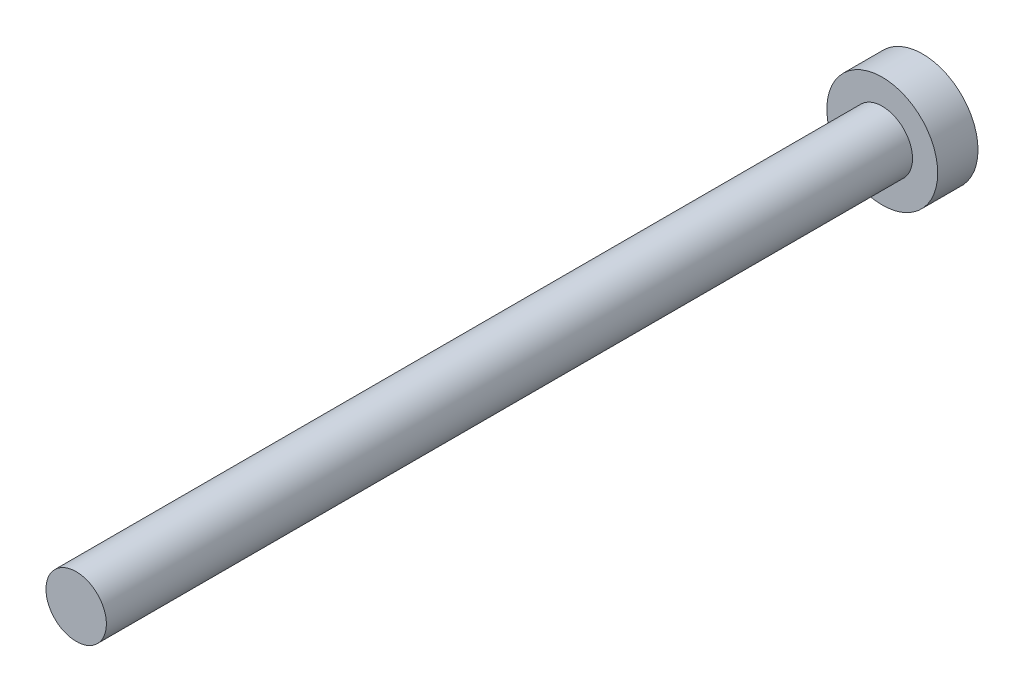
ISO-10303-21;
HEADER;
FILE_DESCRIPTION(('STEP AP214'),'2;1');
FILE_NAME('part.step','',(''),(''),'','','');
FILE_SCHEMA(('AUTOMOTIVE_DESIGN { 1 0 10303 214 1 1 1 1 }'));
ENDSEC;
DATA;
#1=APPLICATION_CONTEXT('core data for automotive mechanical design processes');
#2=APPLICATION_PROTOCOL_DEFINITION('international standard','automotive_design',2000,#1);
#3=PRODUCT_CONTEXT('',#1,'mechanical');
#4=PRODUCT('Part','Part','',(#3));
#5=PRODUCT_RELATED_PRODUCT_CATEGORY('part','',(#4));
#6=PRODUCT_DEFINITION_FORMATION('','',#4);
#7=PRODUCT_DEFINITION_CONTEXT('part definition',#1,'design');
#8=PRODUCT_DEFINITION('design','',#6,#7);
#9=PRODUCT_DEFINITION_SHAPE('','',#8);
#10=(LENGTH_UNIT() NAMED_UNIT(*) SI_UNIT(.MILLI.,.METRE.));
#11=(NAMED_UNIT(*) PLANE_ANGLE_UNIT() SI_UNIT($,.RADIAN.));
#12=(NAMED_UNIT(*) SI_UNIT($,.STERADIAN.) SOLID_ANGLE_UNIT());
#13=UNCERTAINTY_MEASURE_WITH_UNIT(LENGTH_MEASURE(1.E-05),#10,'distance_accuracy_value','');
#14=(GEOMETRIC_REPRESENTATION_CONTEXT(3) GLOBAL_UNCERTAINTY_ASSIGNED_CONTEXT((#13)) GLOBAL_UNIT_ASSIGNED_CONTEXT((#10,
#11,#12)) REPRESENTATION_CONTEXT('',''));
#15=CARTESIAN_POINT('',(0.,0.,0.));
#16=DIRECTION('',(0.,0.,1.));
#17=DIRECTION('',(1.,0.,0.));
#18=AXIS2_PLACEMENT_3D('',#15,#16,#17);
#19=CARTESIAN_POINT('',(0.,0.,40.));
#20=DIRECTION('',(0.,0.,-1.));
#21=DIRECTION('',(-1.,0.,0.));
#22=AXIS2_PLACEMENT_3D('',#19,#20,#21);
#23=CYLINDRICAL_SURFACE('',#22,1.5);
#24=CARTESIAN_POINT('',(0.,0.,40.));
#25=DIRECTION('',(0.,0.,1.));
#26=DIRECTION('',(1.,0.,0.));
#27=AXIS2_PLACEMENT_3D('',#24,#25,#26);
#28=CIRCLE('',#27,1.5);
#29=CARTESIAN_POINT('',(1.5,0.,40.));
#30=VERTEX_POINT('',#29);
#31=EDGE_CURVE('E10',#30,#30,#28,.T.);
#32=ORIENTED_EDGE('',*,*,#31,.F.);
#33=EDGE_LOOP('',(#32));
#34=FACE_BOUND('',#33,.T.);
#35=CARTESIAN_POINT('',(0.,0.,0.));
#36=DIRECTION('',(0.,0.,1.));
#37=DIRECTION('',(1.,0.,0.));
#38=AXIS2_PLACEMENT_3D('',#35,#36,#37);
#39=CIRCLE('',#38,1.5);
#40=CARTESIAN_POINT('',(1.5,0.,0.));
#41=VERTEX_POINT('',#40);
#42=EDGE_CURVE('E40',#41,#41,#39,.T.);
#43=ORIENTED_EDGE('',*,*,#42,.T.);
#44=EDGE_LOOP('',(#43));
#45=FACE_BOUND('',#44,.T.);
#46=ADVANCED_FACE('F37',(#34,#45),#23,.T.);
#47=CARTESIAN_POINT('',(0.,0.,40.));
#48=DIRECTION('',(0.,0.,1.));
#49=DIRECTION('',(1.,0.,0.));
#50=AXIS2_PLACEMENT_3D('',#47,#48,#49);
#51=PLANE('',#50);
#52=ORIENTED_EDGE('',*,*,#31,.T.);
#53=EDGE_LOOP('',(#52));
#54=FACE_BOUND('',#53,.T.);
#55=ADVANCED_FACE('F60',(#54),#51,.T.);
#56=CARTESIAN_POINT('',(0.,0.,0.));
#57=DIRECTION('',(0.,0.,-1.));
#58=DIRECTION('',(-1.,0.,0.));
#59=AXIS2_PLACEMENT_3D('',#56,#57,#58);
#60=CYLINDRICAL_SURFACE('',#59,2.75);
#61=CARTESIAN_POINT('',(0.,0.,0.));
#62=DIRECTION('',(0.,0.,1.));
#63=DIRECTION('',(1.,0.,0.));
#64=AXIS2_PLACEMENT_3D('',#61,#62,#63);
#65=CIRCLE('',#64,2.75);
#66=CARTESIAN_POINT('',(2.75,0.,0.));
#67=VERTEX_POINT('',#66);
#68=EDGE_CURVE('E47',#67,#67,#65,.T.);
#69=ORIENTED_EDGE('',*,*,#68,.F.);
#70=EDGE_LOOP('',(#69));
#71=FACE_BOUND('',#70,.T.);
#72=CARTESIAN_POINT('',(0.,0.,-2.));
#73=DIRECTION('',(0.,0.,1.));
#74=DIRECTION('',(1.,0.,0.));
#75=AXIS2_PLACEMENT_3D('',#72,#73,#74);
#76=CIRCLE('',#75,2.75);
#77=CARTESIAN_POINT('',(2.75,0.,-2.));
#78=VERTEX_POINT('',#77);
#79=EDGE_CURVE('E49',#78,#78,#76,.T.);
#80=ORIENTED_EDGE('',*,*,#79,.T.);
#81=EDGE_LOOP('',(#80));
#82=FACE_BOUND('',#81,.T.);
#83=ADVANCED_FACE('F57',(#71,#82),#60,.T.);
#84=CARTESIAN_POINT('',(0.,0.,0.));
#85=DIRECTION('',(0.,0.,1.));
#86=DIRECTION('',(1.,0.,0.));
#87=AXIS2_PLACEMENT_3D('',#84,#85,#86);
#88=PLANE('',#87);
#89=ORIENTED_EDGE('',*,*,#42,.F.);
#90=EDGE_LOOP('',(#89));
#91=FACE_BOUND('',#90,.T.);
#92=ORIENTED_EDGE('',*,*,#68,.T.);
#93=EDGE_LOOP('',(#92));
#94=FACE_BOUND('',#93,.T.);
#95=ADVANCED_FACE('F55',(#91,#94),#88,.T.);
#96=CARTESIAN_POINT('',(0.,0.,-2.));
#97=DIRECTION('',(0.,0.,1.));
#98=DIRECTION('',(1.,0.,0.));
#99=AXIS2_PLACEMENT_3D('',#96,#97,#98);
#100=PLANE('',#99);
#101=ORIENTED_EDGE('',*,*,#79,.F.);
#102=EDGE_LOOP('',(#101));
#103=FACE_BOUND('',#102,.T.);
#104=ADVANCED_FACE('F64',(#103),#100,.F.);
#105=CLOSED_SHELL('',(#46,#55,#83,#95,#104));
#106=MANIFOLD_SOLID_BREP('B2',#105);
#107=ADVANCED_BREP_SHAPE_REPRESENTATION('',(#18,#106),#14);
#108=SHAPE_DEFINITION_REPRESENTATION(#9,#107);
ENDSEC;
END-ISO-10303-21;
